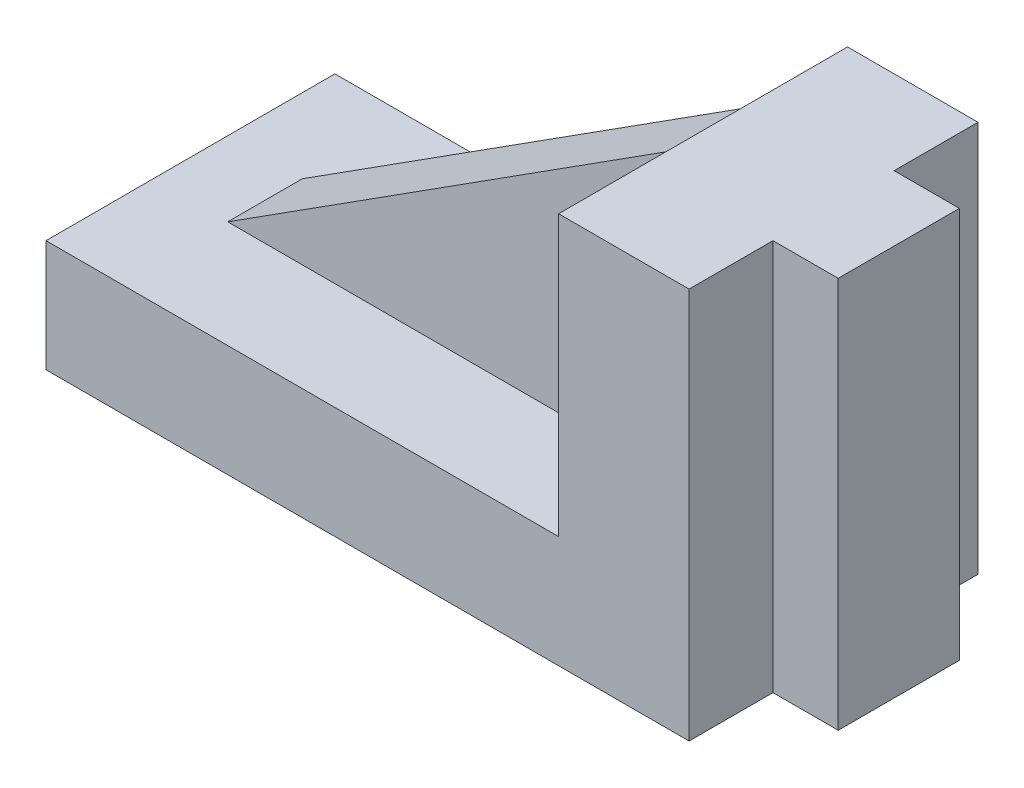
ISO-10303-21;
HEADER;
FILE_DESCRIPTION(('STEP AP214'),'2;1');
FILE_NAME('part.step','',(''),(''),'','','');
FILE_SCHEMA(('AUTOMOTIVE_DESIGN { 1 0 10303 214 1 1 1 1 }'));
ENDSEC;
DATA;
#1=APPLICATION_CONTEXT('core data for automotive mechanical design processes');
#2=APPLICATION_PROTOCOL_DEFINITION('international standard','automotive_design',2000,#1);
#3=PRODUCT_CONTEXT('',#1,'mechanical');
#4=PRODUCT('Part','Part','',(#3));
#5=PRODUCT_RELATED_PRODUCT_CATEGORY('part','',(#4));
#6=PRODUCT_DEFINITION_FORMATION('','',#4);
#7=PRODUCT_DEFINITION_CONTEXT('part definition',#1,'design');
#8=PRODUCT_DEFINITION('design','',#6,#7);
#9=PRODUCT_DEFINITION_SHAPE('','',#8);
#10=(LENGTH_UNIT() NAMED_UNIT(*) SI_UNIT(.MILLI.,.METRE.));
#11=(NAMED_UNIT(*) PLANE_ANGLE_UNIT() SI_UNIT($,.RADIAN.));
#12=(NAMED_UNIT(*) SI_UNIT($,.STERADIAN.) SOLID_ANGLE_UNIT());
#13=UNCERTAINTY_MEASURE_WITH_UNIT(LENGTH_MEASURE(1.E-05),#10,'distance_accuracy_value','');
#14=(GEOMETRIC_REPRESENTATION_CONTEXT(3) GLOBAL_UNCERTAINTY_ASSIGNED_CONTEXT((#13)) GLOBAL_UNIT_ASSIGNED_CONTEXT((#10,
#11,#12)) REPRESENTATION_CONTEXT('',''));
#15=CARTESIAN_POINT('',(0.,0.,0.));
#16=DIRECTION('',(0.,0.,1.));
#17=DIRECTION('',(1.,0.,0.));
#18=AXIS2_PLACEMENT_3D('',#15,#16,#17);
#19=CARTESIAN_POINT('',(55.,42.,-15.5));
#20=DIRECTION('',(1.,0.,0.));
#21=DIRECTION('',(0.,1.,0.));
#22=AXIS2_PLACEMENT_3D('',#19,#20,#21);
#23=PLANE('',#22);
#24=DIRECTION('',(0.,1.,0.));
#25=VECTOR('',#24,1.);
#26=CARTESIAN_POINT('',(55.,12.6872340676308,4.));
#27=LINE('',#26,#25);
#28=CARTESIAN_POINT('',(55.,12.,4.));
#29=VERTEX_POINT('',#28);
#30=CARTESIAN_POINT('',(55.,42.,4.));
#31=VERTEX_POINT('',#30);
#32=EDGE_CURVE('E144',#29,#31,#27,.T.);
#33=ORIENTED_EDGE('',*,*,#32,.F.);
#34=DIRECTION('',(0.,0.,1.));
#35=VECTOR('',#34,1.);
#36=CARTESIAN_POINT('',(55.,12.,-15.5));
#37=LINE('',#36,#35);
#38=CARTESIAN_POINT('',(55.,12.,15.5));
#39=VERTEX_POINT('',#38);
#40=EDGE_CURVE('E176',#29,#39,#37,.T.);
#41=ORIENTED_EDGE('',*,*,#40,.T.);
#42=DIRECTION('',(0.,-1.,0.));
#43=VECTOR('',#42,1.);
#44=CARTESIAN_POINT('',(55.,0.,15.5));
#45=LINE('',#44,#43);
#46=CARTESIAN_POINT('',(55.,42.,15.5));
#47=VERTEX_POINT('',#46);
#48=EDGE_CURVE('E11',#47,#39,#45,.T.);
#49=ORIENTED_EDGE('',*,*,#48,.F.);
#50=DIRECTION('',(0.,0.,1.));
#51=VECTOR('',#50,1.);
#52=CARTESIAN_POINT('',(55.,42.,-15.5));
#53=LINE('',#52,#51);
#54=EDGE_CURVE('E153',#31,#47,#53,.T.);
#55=ORIENTED_EDGE('',*,*,#54,.F.);
#56=EDGE_LOOP('',(#33,#41,#49,#55));
#57=FACE_BOUND('',#56,.T.);
#58=ADVANCED_FACE('F37',(#57),#23,.F.);
#59=CARTESIAN_POINT('',(55.,12.,-15.5));
#60=DIRECTION('',(0.,-1.,0.));
#61=DIRECTION('',(1.,0.,0.));
#62=AXIS2_PLACEMENT_3D('',#59,#60,#61);
#63=PLANE('',#62);
#64=DIRECTION('',(1.,0.,0.));
#65=VECTOR('',#64,1.);
#66=CARTESIAN_POINT('',(8.,12.,4.));
#67=LINE('',#66,#65);
#68=CARTESIAN_POINT('',(8.,12.,4.));
#69=VERTEX_POINT('',#68);
#70=EDGE_CURVE('E143',#69,#29,#67,.T.);
#71=ORIENTED_EDGE('',*,*,#70,.F.);
#72=DIRECTION('',(0.,0.,-1.));
#73=VECTOR('',#72,1.);
#74=CARTESIAN_POINT('',(8.,12.,4.));
#75=LINE('',#74,#73);
#76=CARTESIAN_POINT('',(8.,12.,-4.));
#77=VERTEX_POINT('',#76);
#78=EDGE_CURVE('E140',#69,#77,#75,.T.);
#79=ORIENTED_EDGE('',*,*,#78,.T.);
#80=DIRECTION('',(1.,0.,0.));
#81=VECTOR('',#80,1.);
#82=CARTESIAN_POINT('',(8.,12.,-4.));
#83=LINE('',#82,#81);
#84=CARTESIAN_POINT('',(55.,12.,-4.));
#85=VERTEX_POINT('',#84);
#86=EDGE_CURVE('E271',#77,#85,#83,.T.);
#87=ORIENTED_EDGE('',*,*,#86,.T.);
#88=CARTESIAN_POINT('',(55.,12.,-15.5));
#89=VERTEX_POINT('',#88);
#90=EDGE_CURVE('E158',#89,#85,#37,.T.);
#91=ORIENTED_EDGE('',*,*,#90,.F.);
#92=DIRECTION('',(1.,0.,0.));
#93=VECTOR('',#92,1.);
#94=CARTESIAN_POINT('',(55.,12.,-15.5));
#95=LINE('',#94,#93);
#96=CARTESIAN_POINT('',(0.,12.,-15.5));
#97=VERTEX_POINT('',#96);
#98=EDGE_CURVE('E163',#97,#89,#95,.T.);
#99=ORIENTED_EDGE('',*,*,#98,.F.);
#100=DIRECTION('',(0.,0.,1.));
#101=VECTOR('',#100,1.);
#102=CARTESIAN_POINT('',(0.,12.,-15.5));
#103=LINE('',#102,#101);
#104=CARTESIAN_POINT('',(0.,12.,15.5));
#105=VERTEX_POINT('',#104);
#106=EDGE_CURVE('E60',#97,#105,#103,.T.);
#107=ORIENTED_EDGE('',*,*,#106,.T.);
#108=DIRECTION('',(-1.,0.,0.));
#109=VECTOR('',#108,1.);
#110=CARTESIAN_POINT('',(0.,12.,15.5));
#111=LINE('',#110,#109);
#112=EDGE_CURVE('E45',#39,#105,#111,.T.);
#113=ORIENTED_EDGE('',*,*,#112,.F.);
#114=ORIENTED_EDGE('',*,*,#40,.F.);
#115=EDGE_LOOP('',(#71,#79,#87,#91,#99,#107,#113,#114));
#116=FACE_BOUND('',#115,.T.);
#117=ADVANCED_FACE('F277',(#116),#63,.F.);
#118=CARTESIAN_POINT('',(0.,0.,-15.5));
#119=DIRECTION('',(0.,0.,-1.));
#120=DIRECTION('',(-1.,0.,0.));
#121=AXIS2_PLACEMENT_3D('',#118,#119,#120);
#122=PLANE('',#121);
#123=DIRECTION('',(0.,1.,0.));
#124=VECTOR('',#123,1.);
#125=CARTESIAN_POINT('',(55.,42.,-15.5));
#126=LINE('',#125,#124);
#127=CARTESIAN_POINT('',(55.,42.,-15.5));
#128=VERTEX_POINT('',#127);
#129=EDGE_CURVE('E166',#89,#128,#126,.T.);
#130=ORIENTED_EDGE('',*,*,#129,.T.);
#131=DIRECTION('',(-1.,0.,0.));
#132=VECTOR('',#131,1.);
#133=CARTESIAN_POINT('',(0.,42.,-15.5));
#134=LINE('',#133,#132);
#135=CARTESIAN_POINT('',(69.,42.,-15.5));
#136=VERTEX_POINT('',#135);
#137=EDGE_CURVE('E215',#136,#128,#134,.T.);
#138=ORIENTED_EDGE('',*,*,#137,.F.);
#139=DIRECTION('',(0.,1.,0.));
#140=VECTOR('',#139,1.);
#141=CARTESIAN_POINT('',(69.,0.,-15.5));
#142=LINE('',#141,#140);
#143=CARTESIAN_POINT('',(69.,0.,-15.5));
#144=VERTEX_POINT('',#143);
#145=EDGE_CURVE('E203',#144,#136,#142,.T.);
#146=ORIENTED_EDGE('',*,*,#145,.F.);
#147=DIRECTION('',(1.,0.,0.));
#148=VECTOR('',#147,1.);
#149=CARTESIAN_POINT('',(0.,0.,-15.5));
#150=LINE('',#149,#148);
#151=CARTESIAN_POINT('',(0.,0.,-15.5));
#152=VERTEX_POINT('',#151);
#153=EDGE_CURVE('E222',#152,#144,#150,.T.);
#154=ORIENTED_EDGE('',*,*,#153,.F.);
#155=DIRECTION('',(0.,-1.,0.));
#156=VECTOR('',#155,1.);
#157=CARTESIAN_POINT('',(0.,0.,-15.5));
#158=LINE('',#157,#156);
#159=EDGE_CURVE('E195',#97,#152,#158,.T.);
#160=ORIENTED_EDGE('',*,*,#159,.F.);
#161=ORIENTED_EDGE('',*,*,#98,.T.);
#162=EDGE_LOOP('',(#130,#138,#146,#154,#160,#161));
#163=FACE_BOUND('',#162,.T.);
#164=ADVANCED_FACE('F267',(#163),#122,.T.);
#165=CARTESIAN_POINT('',(0.,0.,15.5));
#166=DIRECTION('',(1.,0.,0.));
#167=DIRECTION('',(0.,0.,-1.));
#168=AXIS2_PLACEMENT_3D('',#165,#166,#167);
#169=PLANE('',#168);
#170=DIRECTION('',(0.,-1.,0.));
#171=VECTOR('',#170,1.);
#172=CARTESIAN_POINT('',(0.,0.,15.5));
#173=LINE('',#172,#171);
#174=CARTESIAN_POINT('',(0.,0.,15.5));
#175=VERTEX_POINT('',#174);
#176=EDGE_CURVE('E212',#105,#175,#173,.T.);
#177=ORIENTED_EDGE('',*,*,#176,.F.);
#178=ORIENTED_EDGE('',*,*,#106,.F.);
#179=ORIENTED_EDGE('',*,*,#159,.T.);
#180=DIRECTION('',(0.,0.,-1.));
#181=VECTOR('',#180,1.);
#182=CARTESIAN_POINT('',(0.,0.,15.5));
#183=LINE('',#182,#181);
#184=EDGE_CURVE('E231',#175,#152,#183,.T.);
#185=ORIENTED_EDGE('',*,*,#184,.F.);
#186=EDGE_LOOP('',(#177,#178,#179,#185));
#187=FACE_BOUND('',#186,.T.);
#188=ADVANCED_FACE('F39',(#187),#169,.F.);
#189=CARTESIAN_POINT('',(0.,0.,15.5));
#190=DIRECTION('',(0.,1.,0.));
#191=DIRECTION('',(0.,0.,1.));
#192=AXIS2_PLACEMENT_3D('',#189,#190,#191);
#193=PLANE('',#192);
#194=DIRECTION('',(0.,0.,-1.));
#195=VECTOR('',#194,1.);
#196=CARTESIAN_POINT('',(76.,0.,15.5));
#197=LINE('',#196,#195);
#198=CARTESIAN_POINT('',(76.,0.,6.5));
#199=VERTEX_POINT('',#198);
#200=CARTESIAN_POINT('',(76.,0.,-6.5));
#201=VERTEX_POINT('',#200);
#202=EDGE_CURVE('E228',#199,#201,#197,.T.);
#203=ORIENTED_EDGE('',*,*,#202,.F.);
#204=DIRECTION('',(1.,0.,0.));
#205=VECTOR('',#204,1.);
#206=CARTESIAN_POINT('',(69.,0.,6.5));
#207=LINE('',#206,#205);
#208=CARTESIAN_POINT('',(69.,0.,6.5));
#209=VERTEX_POINT('',#208);
#210=EDGE_CURVE('E189',#209,#199,#207,.T.);
#211=ORIENTED_EDGE('',*,*,#210,.F.);
#212=DIRECTION('',(0.,0.,-1.));
#213=VECTOR('',#212,1.);
#214=CARTESIAN_POINT('',(69.,0.,6.5));
#215=LINE('',#214,#213);
#216=CARTESIAN_POINT('',(69.,0.,15.5));
#217=VERTEX_POINT('',#216);
#218=EDGE_CURVE('E180',#217,#209,#215,.T.);
#219=ORIENTED_EDGE('',*,*,#218,.F.);
#220=DIRECTION('',(1.,0.,0.));
#221=VECTOR('',#220,1.);
#222=CARTESIAN_POINT('',(0.,0.,15.5));
#223=LINE('',#222,#221);
#224=EDGE_CURVE('E214',#175,#217,#223,.T.);
#225=ORIENTED_EDGE('',*,*,#224,.F.);
#226=ORIENTED_EDGE('',*,*,#184,.T.);
#227=ORIENTED_EDGE('',*,*,#153,.T.);
#228=DIRECTION('',(0.,0.,-1.));
#229=VECTOR('',#228,1.);
#230=CARTESIAN_POINT('',(69.,0.,-6.5));
#231=LINE('',#230,#229);
#232=CARTESIAN_POINT('',(69.,0.,-6.5));
#233=VERTEX_POINT('',#232);
#234=EDGE_CURVE('E199',#233,#144,#231,.T.);
#235=ORIENTED_EDGE('',*,*,#234,.F.);
#236=DIRECTION('',(1.,0.,0.));
#237=VECTOR('',#236,1.);
#238=CARTESIAN_POINT('',(69.,0.,-6.5));
#239=LINE('',#238,#237);
#240=EDGE_CURVE('E173',#233,#201,#239,.T.);
#241=ORIENTED_EDGE('',*,*,#240,.T.);
#242=EDGE_LOOP('',(#203,#211,#219,#225,#226,#227,#235,#241));
#243=FACE_BOUND('',#242,.T.);
#244=ADVANCED_FACE('F243',(#243),#193,.F.);
#245=CARTESIAN_POINT('',(76.,0.,15.5));
#246=DIRECTION('',(-1.,0.,0.));
#247=DIRECTION('',(0.,0.,1.));
#248=AXIS2_PLACEMENT_3D('',#245,#246,#247);
#249=PLANE('',#248);
#250=DIRECTION('',(0.,0.,-1.));
#251=VECTOR('',#250,1.);
#252=CARTESIAN_POINT('',(76.,42.,15.5));
#253=LINE('',#252,#251);
#254=CARTESIAN_POINT('',(76.,42.,6.50000000000001));
#255=VERTEX_POINT('',#254);
#256=CARTESIAN_POINT('',(76.,42.,-6.5));
#257=VERTEX_POINT('',#256);
#258=EDGE_CURVE('E220',#255,#257,#253,.T.);
#259=ORIENTED_EDGE('',*,*,#258,.F.);
#260=DIRECTION('',(0.,1.,0.));
#261=VECTOR('',#260,1.);
#262=CARTESIAN_POINT('',(76.,42.,6.50000000000001));
#263=LINE('',#262,#261);
#264=EDGE_CURVE('E181',#199,#255,#263,.T.);
#265=ORIENTED_EDGE('',*,*,#264,.F.);
#266=ORIENTED_EDGE('',*,*,#202,.T.);
#267=DIRECTION('',(0.,-1.,0.));
#268=VECTOR('',#267,1.);
#269=CARTESIAN_POINT('',(76.,42.,-6.5));
#270=LINE('',#269,#268);
#271=EDGE_CURVE('E191',#257,#201,#270,.T.);
#272=ORIENTED_EDGE('',*,*,#271,.F.);
#273=EDGE_LOOP('',(#259,#265,#266,#272));
#274=FACE_BOUND('',#273,.T.);
#275=ADVANCED_FACE('F256',(#274),#249,.F.);
#276=CARTESIAN_POINT('',(0.,42.,15.5));
#277=DIRECTION('',(0.,-1.,0.));
#278=DIRECTION('',(0.,0.,-1.));
#279=AXIS2_PLACEMENT_3D('',#276,#277,#278);
#280=PLANE('',#279);
#281=ORIENTED_EDGE('',*,*,#137,.T.);
#282=CARTESIAN_POINT('',(55.,42.,-4.));
#283=VERTEX_POINT('',#282);
#284=EDGE_CURVE('E157',#128,#283,#53,.T.);
#285=ORIENTED_EDGE('',*,*,#284,.T.);
#286=DIRECTION('',(0.,0.,-1.));
#287=VECTOR('',#286,1.);
#288=CARTESIAN_POINT('',(55.,42.,4.));
#289=LINE('',#288,#287);
#290=EDGE_CURVE('E138',#31,#283,#289,.T.);
#291=ORIENTED_EDGE('',*,*,#290,.F.);
#292=ORIENTED_EDGE('',*,*,#54,.T.);
#293=DIRECTION('',(-1.,0.,0.));
#294=VECTOR('',#293,1.);
#295=CARTESIAN_POINT('',(0.,42.,15.5));
#296=LINE('',#295,#294);
#297=CARTESIAN_POINT('',(69.,42.,15.5));
#298=VERTEX_POINT('',#297);
#299=EDGE_CURVE('E218',#298,#47,#296,.T.);
#300=ORIENTED_EDGE('',*,*,#299,.F.);
#301=DIRECTION('',(0.,0.,1.));
#302=VECTOR('',#301,1.);
#303=CARTESIAN_POINT('',(69.,42.,15.5));
#304=LINE('',#303,#302);
#305=CARTESIAN_POINT('',(69.,42.,6.50000000000001));
#306=VERTEX_POINT('',#305);
#307=EDGE_CURVE('E187',#306,#298,#304,.T.);
#308=ORIENTED_EDGE('',*,*,#307,.F.);
#309=DIRECTION('',(1.,0.,0.));
#310=VECTOR('',#309,1.);
#311=CARTESIAN_POINT('',(69.,42.,6.50000000000001));
#312=LINE('',#311,#310);
#313=EDGE_CURVE('E192',#306,#255,#312,.T.);
#314=ORIENTED_EDGE('',*,*,#313,.T.);
#315=ORIENTED_EDGE('',*,*,#258,.T.);
#316=DIRECTION('',(1.,0.,0.));
#317=VECTOR('',#316,1.);
#318=CARTESIAN_POINT('',(69.,42.,-6.5));
#319=LINE('',#318,#317);
#320=CARTESIAN_POINT('',(69.,42.,-6.5));
#321=VERTEX_POINT('',#320);
#322=EDGE_CURVE('E197',#321,#257,#319,.T.);
#323=ORIENTED_EDGE('',*,*,#322,.F.);
#324=DIRECTION('',(0.,0.,1.));
#325=VECTOR('',#324,1.);
#326=CARTESIAN_POINT('',(69.,42.,-15.5));
#327=LINE('',#326,#325);
#328=EDGE_CURVE('E208',#136,#321,#327,.T.);
#329=ORIENTED_EDGE('',*,*,#328,.F.);
#330=EDGE_LOOP('',(#281,#285,#291,#292,#300,#308,#314,#315,#323,#329));
#331=FACE_BOUND('',#330,.T.);
#332=ADVANCED_FACE('F162',(#331),#280,.F.);
#333=CARTESIAN_POINT('',(0.,0.,15.5));
#334=DIRECTION('',(0.,0.,-1.));
#335=DIRECTION('',(-1.,0.,0.));
#336=AXIS2_PLACEMENT_3D('',#333,#334,#335);
#337=PLANE('',#336);
#338=ORIENTED_EDGE('',*,*,#299,.T.);
#339=ORIENTED_EDGE('',*,*,#48,.T.);
#340=ORIENTED_EDGE('',*,*,#112,.T.);
#341=ORIENTED_EDGE('',*,*,#176,.T.);
#342=ORIENTED_EDGE('',*,*,#224,.T.);
#343=DIRECTION('',(0.,-1.,0.));
#344=VECTOR('',#343,1.);
#345=CARTESIAN_POINT('',(69.,0.,15.5));
#346=LINE('',#345,#344);
#347=EDGE_CURVE('E178',#298,#217,#346,.T.);
#348=ORIENTED_EDGE('',*,*,#347,.F.);
#349=EDGE_LOOP('',(#338,#339,#340,#341,#342,#348));
#350=FACE_BOUND('',#349,.T.);
#351=ADVANCED_FACE('F235',(#350),#337,.F.);
#352=CARTESIAN_POINT('',(69.,42.,-6.5));
#353=DIRECTION('',(0.,0.,1.));
#354=DIRECTION('',(0.,-1.,0.));
#355=AXIS2_PLACEMENT_3D('',#352,#353,#354);
#356=PLANE('',#355);
#357=ORIENTED_EDGE('',*,*,#271,.T.);
#358=ORIENTED_EDGE('',*,*,#240,.F.);
#359=DIRECTION('',(0.,-1.,0.));
#360=VECTOR('',#359,1.);
#361=CARTESIAN_POINT('',(69.,42.,-6.5));
#362=LINE('',#361,#360);
#363=EDGE_CURVE('E205',#321,#233,#362,.T.);
#364=ORIENTED_EDGE('',*,*,#363,.F.);
#365=ORIENTED_EDGE('',*,*,#322,.T.);
#366=EDGE_LOOP('',(#357,#358,#364,#365));
#367=FACE_BOUND('',#366,.T.);
#368=ADVANCED_FACE('F259',(#367),#356,.F.);
#369=CARTESIAN_POINT('',(69.,0.,0.));
#370=DIRECTION('',(1.,0.,0.));
#371=DIRECTION('',(0.,0.,-1.));
#372=AXIS2_PLACEMENT_3D('',#369,#370,#371);
#373=PLANE('',#372);
#374=ORIENTED_EDGE('',*,*,#145,.T.);
#375=ORIENTED_EDGE('',*,*,#328,.T.);
#376=ORIENTED_EDGE('',*,*,#363,.T.);
#377=ORIENTED_EDGE('',*,*,#234,.T.);
#378=EDGE_LOOP('',(#374,#375,#376,#377));
#379=FACE_BOUND('',#378,.T.);
#380=ADVANCED_FACE('F261',(#379),#373,.T.);
#381=CARTESIAN_POINT('',(69.,42.,6.50000000000001));
#382=DIRECTION('',(0.,0.,-1.));
#383=DIRECTION('',(0.,1.,0.));
#384=AXIS2_PLACEMENT_3D('',#381,#382,#383);
#385=PLANE('',#384);
#386=ORIENTED_EDGE('',*,*,#264,.T.);
#387=ORIENTED_EDGE('',*,*,#313,.F.);
#388=DIRECTION('',(0.,1.,0.));
#389=VECTOR('',#388,1.);
#390=CARTESIAN_POINT('',(69.,42.,6.50000000000001));
#391=LINE('',#390,#389);
#392=EDGE_CURVE('E184',#209,#306,#391,.T.);
#393=ORIENTED_EDGE('',*,*,#392,.F.);
#394=ORIENTED_EDGE('',*,*,#210,.T.);
#395=EDGE_LOOP('',(#386,#387,#393,#394));
#396=FACE_BOUND('',#395,.T.);
#397=ADVANCED_FACE('F253',(#396),#385,.F.);
#398=CARTESIAN_POINT('',(69.,0.,0.));
#399=DIRECTION('',(-1.,0.,0.));
#400=DIRECTION('',(0.,0.,1.));
#401=AXIS2_PLACEMENT_3D('',#398,#399,#400);
#402=PLANE('',#401);
#403=ORIENTED_EDGE('',*,*,#347,.T.);
#404=ORIENTED_EDGE('',*,*,#218,.T.);
#405=ORIENTED_EDGE('',*,*,#392,.T.);
#406=ORIENTED_EDGE('',*,*,#307,.T.);
#407=EDGE_LOOP('',(#403,#404,#405,#406));
#408=FACE_BOUND('',#407,.T.);
#409=ADVANCED_FACE('F251',(#408),#402,.F.);
#410=ORIENTED_EDGE('',*,*,#90,.T.);
#411=DIRECTION('',(0.,1.,0.));
#412=VECTOR('',#411,1.);
#413=CARTESIAN_POINT('',(55.,12.6872340676308,-4.));
#414=LINE('',#413,#412);
#415=EDGE_CURVE('E52',#85,#283,#414,.T.);
#416=ORIENTED_EDGE('',*,*,#415,.T.);
#417=ORIENTED_EDGE('',*,*,#284,.F.);
#418=ORIENTED_EDGE('',*,*,#129,.F.);
#419=EDGE_LOOP('',(#410,#416,#417,#418));
#420=FACE_BOUND('',#419,.T.);
#421=ADVANCED_FACE('F270',(#420),#23,.F.);
#422=CARTESIAN_POINT('',(55.,42.,4.));
#423=DIRECTION('',(0.538035452921865,-0.842922209577588,0.));
#424=DIRECTION('',(0.842922209577588,0.538035452921865,0.));
#425=AXIS2_PLACEMENT_3D('',#422,#423,#424);
#426=PLANE('',#425);
#427=DIRECTION('',(-0.842922209577588,-0.538035452921865,0.));
#428=VECTOR('',#427,1.);
#429=CARTESIAN_POINT('',(55.,42.,-4.));
#430=LINE('',#429,#428);
#431=EDGE_CURVE('E272',#283,#77,#430,.T.);
#432=ORIENTED_EDGE('',*,*,#431,.T.);
#433=ORIENTED_EDGE('',*,*,#78,.F.);
#434=DIRECTION('',(-0.842922209577588,-0.538035452921865,0.));
#435=VECTOR('',#434,1.);
#436=CARTESIAN_POINT('',(55.,42.,4.));
#437=LINE('',#436,#435);
#438=EDGE_CURVE('E134',#31,#69,#437,.T.);
#439=ORIENTED_EDGE('',*,*,#438,.F.);
#440=ORIENTED_EDGE('',*,*,#290,.T.);
#441=EDGE_LOOP('',(#432,#433,#439,#440));
#442=FACE_BOUND('',#441,.T.);
#443=ADVANCED_FACE('F136',(#442),#426,.F.);
#444=CARTESIAN_POINT('',(0.,0.,4.));
#445=DIRECTION('',(0.,0.,-1.));
#446=DIRECTION('',(-1.,0.,0.));
#447=AXIS2_PLACEMENT_3D('',#444,#445,#446);
#448=PLANE('',#447);
#449=ORIENTED_EDGE('',*,*,#32,.T.);
#450=ORIENTED_EDGE('',*,*,#438,.T.);
#451=ORIENTED_EDGE('',*,*,#70,.T.);
#452=EDGE_LOOP('',(#449,#450,#451));
#453=FACE_BOUND('',#452,.T.);
#454=ADVANCED_FACE('F148',(#453),#448,.F.);
#455=CARTESIAN_POINT('',(0.,0.,-4.));
#456=DIRECTION('',(0.,0.,-1.));
#457=DIRECTION('',(-1.,0.,0.));
#458=AXIS2_PLACEMENT_3D('',#455,#456,#457);
#459=PLANE('',#458);
#460=ORIENTED_EDGE('',*,*,#431,.F.);
#461=ORIENTED_EDGE('',*,*,#415,.F.);
#462=ORIENTED_EDGE('',*,*,#86,.F.);
#463=EDGE_LOOP('',(#460,#461,#462));
#464=FACE_BOUND('',#463,.T.);
#465=ADVANCED_FACE('F276',(#464),#459,.T.);
#466=CLOSED_SHELL('',(#58,#117,#164,#188,#244,#275,#332,#351,#368,#380,#397,#409,#421,#443,#454,#465));
#467=MANIFOLD_SOLID_BREP('B2',#466);
#468=ADVANCED_BREP_SHAPE_REPRESENTATION('',(#18,#467),#14);
#469=SHAPE_DEFINITION_REPRESENTATION(#9,#468);
ENDSEC;
END-ISO-10303-21;
